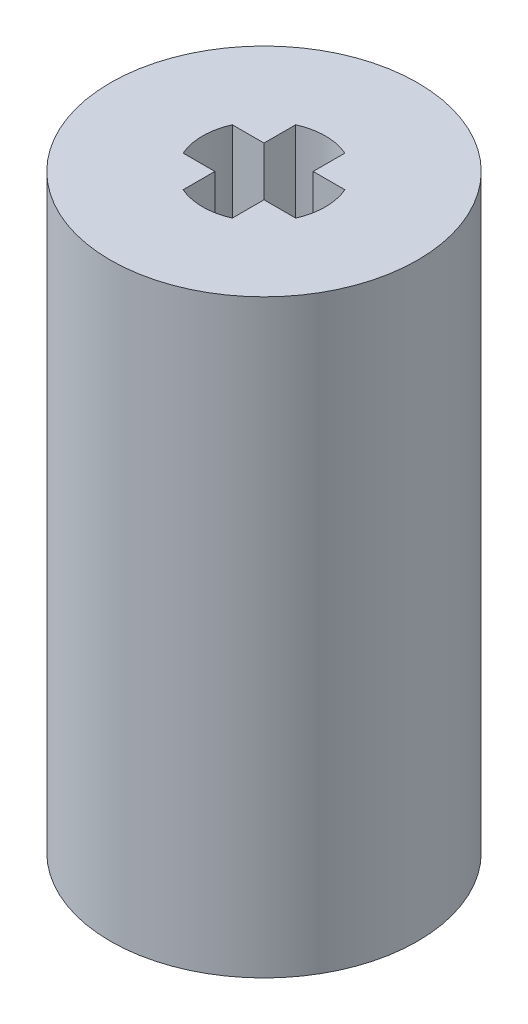
ISO-10303-21;
HEADER;
FILE_DESCRIPTION(('STEP AP214'),'2;1');
FILE_NAME('part.step','',(''),(''),'','','');
FILE_SCHEMA(('AUTOMOTIVE_DESIGN { 1 0 10303 214 1 1 1 1 }'));
ENDSEC;
DATA;
#1=APPLICATION_CONTEXT('core data for automotive mechanical design processes');
#2=APPLICATION_PROTOCOL_DEFINITION('international standard','automotive_design',2000,#1);
#3=PRODUCT_CONTEXT('',#1,'mechanical');
#4=PRODUCT('Part','Part','',(#3));
#5=PRODUCT_RELATED_PRODUCT_CATEGORY('part','',(#4));
#6=PRODUCT_DEFINITION_FORMATION('','',#4);
#7=PRODUCT_DEFINITION_CONTEXT('part definition',#1,'design');
#8=PRODUCT_DEFINITION('design','',#6,#7);
#9=PRODUCT_DEFINITION_SHAPE('','',#8);
#10=(LENGTH_UNIT() NAMED_UNIT(*) SI_UNIT(.MILLI.,.METRE.));
#11=(NAMED_UNIT(*) PLANE_ANGLE_UNIT() SI_UNIT($,.RADIAN.));
#12=(NAMED_UNIT(*) SI_UNIT($,.STERADIAN.) SOLID_ANGLE_UNIT());
#13=UNCERTAINTY_MEASURE_WITH_UNIT(LENGTH_MEASURE(1.E-05),#10,'distance_accuracy_value','');
#14=(GEOMETRIC_REPRESENTATION_CONTEXT(3) GLOBAL_UNCERTAINTY_ASSIGNED_CONTEXT((#13)) GLOBAL_UNIT_ASSIGNED_CONTEXT((#10,
#11,#12)) REPRESENTATION_CONTEXT('',''));
#15=CARTESIAN_POINT('',(0.,0.,0.));
#16=DIRECTION('',(0.,0.,1.));
#17=DIRECTION('',(1.,0.,0.));
#18=AXIS2_PLACEMENT_3D('',#15,#16,#17);
#19=CARTESIAN_POINT('',(0.,24.,0.));
#20=DIRECTION('',(0.,1.,0.));
#21=DIRECTION('',(0.,0.,1.));
#22=AXIS2_PLACEMENT_3D('',#19,#20,#21);
#23=PLANE('',#22);
#24=CARTESIAN_POINT('',(0.,24.,0.));
#25=DIRECTION('',(0.,1.,0.));
#26=DIRECTION('',(0.,0.,1.));
#27=AXIS2_PLACEMENT_3D('',#24,#25,#26);
#28=CIRCLE('',#27,6.25);
#29=CARTESIAN_POINT('',(0.,24.,6.25));
#30=VERTEX_POINT('',#29);
#31=EDGE_CURVE('E11',#30,#30,#28,.T.);
#32=ORIENTED_EDGE('',*,*,#31,.T.);
#33=EDGE_LOOP('',(#32));
#34=FACE_BOUND('',#33,.T.);
#35=DIRECTION('',(0.,0.,-1.));
#36=VECTOR('',#35,1.);
#37=CARTESIAN_POINT('',(-1.,24.,0.));
#38=LINE('',#37,#36);
#39=CARTESIAN_POINT('',(-1.,24.,-1.));
#40=VERTEX_POINT('',#39);
#41=CARTESIAN_POINT('',(-1.,24.,-2.29128784747792));
#42=VERTEX_POINT('',#41);
#43=EDGE_CURVE('E186',#40,#42,#38,.T.);
#44=ORIENTED_EDGE('',*,*,#43,.T.);
#45=CARTESIAN_POINT('',(0.,24.,0.));
#46=DIRECTION('',(0.,1.,0.));
#47=DIRECTION('',(0.,0.,1.));
#48=AXIS2_PLACEMENT_3D('',#45,#46,#47);
#49=CIRCLE('',#48,2.5);
#50=CARTESIAN_POINT('',(1.,24.,-2.29128784747792));
#51=VERTEX_POINT('',#50);
#52=EDGE_CURVE('E50',#42,#51,#49,.F.);
#53=ORIENTED_EDGE('',*,*,#52,.T.);
#54=DIRECTION('',(0.,0.,-1.));
#55=VECTOR('',#54,1.);
#56=CARTESIAN_POINT('',(1.,24.,0.));
#57=LINE('',#56,#55);
#58=CARTESIAN_POINT('',(1.,24.,-1.));
#59=VERTEX_POINT('',#58);
#60=EDGE_CURVE('E157',#59,#51,#57,.T.);
#61=ORIENTED_EDGE('',*,*,#60,.F.);
#62=DIRECTION('',(1.,0.,0.));
#63=VECTOR('',#62,1.);
#64=CARTESIAN_POINT('',(0.,24.,-1.));
#65=LINE('',#64,#63);
#66=CARTESIAN_POINT('',(2.29128784747792,24.,-1.));
#67=VERTEX_POINT('',#66);
#68=EDGE_CURVE('E160',#59,#67,#65,.T.);
#69=ORIENTED_EDGE('',*,*,#68,.T.);
#70=CARTESIAN_POINT('',(0.,24.,0.));
#71=DIRECTION('',(0.,1.,0.));
#72=DIRECTION('',(0.,0.,1.));
#73=AXIS2_PLACEMENT_3D('',#70,#71,#72);
#74=CIRCLE('',#73,2.5);
#75=CARTESIAN_POINT('',(2.29128784747792,24.,1.));
#76=VERTEX_POINT('',#75);
#77=EDGE_CURVE('E209',#67,#76,#74,.F.);
#78=ORIENTED_EDGE('',*,*,#77,.T.);
#79=DIRECTION('',(1.,0.,0.));
#80=VECTOR('',#79,1.);
#81=CARTESIAN_POINT('',(0.,24.,1.));
#82=LINE('',#81,#80);
#83=CARTESIAN_POINT('',(1.,24.,1.));
#84=VERTEX_POINT('',#83);
#85=EDGE_CURVE('E206',#84,#76,#82,.T.);
#86=ORIENTED_EDGE('',*,*,#85,.F.);
#87=DIRECTION('',(0.,0.,-1.));
#88=VECTOR('',#87,1.);
#89=CARTESIAN_POINT('',(1.,24.,0.));
#90=LINE('',#89,#88);
#91=CARTESIAN_POINT('',(1.,24.,2.29128784747792));
#92=VERTEX_POINT('',#91);
#93=EDGE_CURVE('E203',#92,#84,#90,.T.);
#94=ORIENTED_EDGE('',*,*,#93,.F.);
#95=CARTESIAN_POINT('',(0.,24.,0.));
#96=DIRECTION('',(0.,1.,0.));
#97=DIRECTION('',(0.,0.,1.));
#98=AXIS2_PLACEMENT_3D('',#95,#96,#97);
#99=CIRCLE('',#98,2.5);
#100=CARTESIAN_POINT('',(-1.,24.,2.29128784747792));
#101=VERTEX_POINT('',#100);
#102=EDGE_CURVE('E200',#92,#101,#99,.F.);
#103=ORIENTED_EDGE('',*,*,#102,.T.);
#104=DIRECTION('',(0.,0.,-1.));
#105=VECTOR('',#104,1.);
#106=CARTESIAN_POINT('',(-1.,24.,0.));
#107=LINE('',#106,#105);
#108=CARTESIAN_POINT('',(-1.,24.,1.));
#109=VERTEX_POINT('',#108);
#110=EDGE_CURVE('E197',#101,#109,#107,.T.);
#111=ORIENTED_EDGE('',*,*,#110,.T.);
#112=DIRECTION('',(1.,0.,0.));
#113=VECTOR('',#112,1.);
#114=CARTESIAN_POINT('',(0.,24.,1.));
#115=LINE('',#114,#113);
#116=CARTESIAN_POINT('',(-2.29128784747792,24.,1.));
#117=VERTEX_POINT('',#116);
#118=EDGE_CURVE('E194',#117,#109,#115,.T.);
#119=ORIENTED_EDGE('',*,*,#118,.F.);
#120=CARTESIAN_POINT('',(0.,24.,0.));
#121=DIRECTION('',(0.,1.,0.));
#122=DIRECTION('',(0.,0.,1.));
#123=AXIS2_PLACEMENT_3D('',#120,#121,#122);
#124=CIRCLE('',#123,2.5);
#125=CARTESIAN_POINT('',(-2.29128784747792,24.,-1.));
#126=VERTEX_POINT('',#125);
#127=EDGE_CURVE('E191',#126,#117,#124,.T.);
#128=ORIENTED_EDGE('',*,*,#127,.F.);
#129=DIRECTION('',(1.,0.,0.));
#130=VECTOR('',#129,1.);
#131=CARTESIAN_POINT('',(0.,24.,-1.));
#132=LINE('',#131,#130);
#133=EDGE_CURVE('E188',#126,#40,#132,.T.);
#134=ORIENTED_EDGE('',*,*,#133,.T.);
#135=EDGE_LOOP('',(#44,#53,#61,#69,#78,#86,#94,#103,#111,#119,#128,#134));
#136=FACE_BOUND('',#135,.T.);
#137=ADVANCED_FACE('F35',(#34,#136),#23,.T.);
#138=CARTESIAN_POINT('',(0.,24.,0.));
#139=DIRECTION('',(0.,-1.,0.));
#140=DIRECTION('',(0.,0.,-1.));
#141=AXIS2_PLACEMENT_3D('',#138,#139,#140);
#142=CYLINDRICAL_SURFACE('',#141,6.25);
#143=ORIENTED_EDGE('',*,*,#31,.F.);
#144=EDGE_LOOP('',(#143));
#145=FACE_BOUND('',#144,.T.);
#146=CARTESIAN_POINT('',(0.,0.,0.));
#147=DIRECTION('',(0.,1.,0.));
#148=DIRECTION('',(0.,0.,1.));
#149=AXIS2_PLACEMENT_3D('',#146,#147,#148);
#150=CIRCLE('',#149,6.25);
#151=CARTESIAN_POINT('',(0.,0.,6.25));
#152=VERTEX_POINT('',#151);
#153=EDGE_CURVE('E39',#152,#152,#150,.T.);
#154=ORIENTED_EDGE('',*,*,#153,.T.);
#155=EDGE_LOOP('',(#154));
#156=FACE_BOUND('',#155,.T.);
#157=ADVANCED_FACE('F37',(#145,#156),#142,.T.);
#158=CARTESIAN_POINT('',(0.,0.,0.));
#159=DIRECTION('',(0.,1.,0.));
#160=DIRECTION('',(0.,0.,1.));
#161=AXIS2_PLACEMENT_3D('',#158,#159,#160);
#162=PLANE('',#161);
#163=DIRECTION('',(0.,0.,1.));
#164=VECTOR('',#163,1.);
#165=CARTESIAN_POINT('',(1.67163841784041,0.,3.075));
#166=LINE('',#165,#164);
#167=CARTESIAN_POINT('',(1.67163841784041,0.,-3.075));
#168=VERTEX_POINT('',#167);
#169=CARTESIAN_POINT('',(1.67163841784041,0.,3.075));
#170=VERTEX_POINT('',#169);
#171=EDGE_CURVE('E239',#168,#170,#166,.T.);
#172=ORIENTED_EDGE('',*,*,#171,.F.);
#173=CARTESIAN_POINT('',(0.,0.,0.));
#174=DIRECTION('',(0.,-1.,0.));
#175=DIRECTION('',(0.,0.,1.));
#176=AXIS2_PLACEMENT_3D('',#173,#174,#175);
#177=CIRCLE('',#176,3.5);
#178=EDGE_CURVE('E58',#170,#168,#177,.T.);
#179=ORIENTED_EDGE('',*,*,#178,.F.);
#180=EDGE_LOOP('',(#172,#179));
#181=FACE_BOUND('',#180,.T.);
#182=ORIENTED_EDGE('',*,*,#153,.F.);
#183=EDGE_LOOP('',(#182));
#184=FACE_BOUND('',#183,.T.);
#185=ADVANCED_FACE('F254',(#181,#184),#162,.F.);
#186=CARTESIAN_POINT('',(0.,12.,0.));
#187=DIRECTION('',(0.,-1.,0.));
#188=DIRECTION('',(0.,0.,-1.));
#189=AXIS2_PLACEMENT_3D('',#186,#187,#188);
#190=CYLINDRICAL_SURFACE('',#189,3.5);
#191=ORIENTED_EDGE('',*,*,#178,.T.);
#192=DIRECTION('',(0.,-1.,0.));
#193=VECTOR('',#192,1.);
#194=CARTESIAN_POINT('',(1.67163841784041,12.,-3.075));
#195=LINE('',#194,#193);
#196=CARTESIAN_POINT('',(1.67163841784041,12.,-3.075));
#197=VERTEX_POINT('',#196);
#198=EDGE_CURVE('E242',#197,#168,#195,.T.);
#199=ORIENTED_EDGE('',*,*,#198,.F.);
#200=CARTESIAN_POINT('',(0.,12.,0.));
#201=DIRECTION('',(0.,-1.,0.));
#202=DIRECTION('',(0.,0.,1.));
#203=AXIS2_PLACEMENT_3D('',#200,#201,#202);
#204=CIRCLE('',#203,3.5);
#205=CARTESIAN_POINT('',(1.67163841784041,12.,3.075));
#206=VERTEX_POINT('',#205);
#207=EDGE_CURVE('E235',#206,#197,#204,.T.);
#208=ORIENTED_EDGE('',*,*,#207,.F.);
#209=DIRECTION('',(0.,-1.,0.));
#210=VECTOR('',#209,1.);
#211=CARTESIAN_POINT('',(1.67163841784041,12.,3.075));
#212=LINE('',#211,#210);
#213=EDGE_CURVE('E246',#206,#170,#212,.T.);
#214=ORIENTED_EDGE('',*,*,#213,.T.);
#215=EDGE_LOOP('',(#191,#199,#208,#214));
#216=FACE_BOUND('',#215,.T.);
#217=ADVANCED_FACE('F257',(#216),#190,.F.);
#218=CARTESIAN_POINT('',(1.67163841784041,12.,3.075));
#219=DIRECTION('',(1.,0.,0.));
#220=DIRECTION('',(0.,0.,-1.));
#221=AXIS2_PLACEMENT_3D('',#218,#219,#220);
#222=PLANE('',#221);
#223=ORIENTED_EDGE('',*,*,#171,.T.);
#224=ORIENTED_EDGE('',*,*,#213,.F.);
#225=DIRECTION('',(0.,0.,1.));
#226=VECTOR('',#225,1.);
#227=CARTESIAN_POINT('',(1.67163841784041,12.,3.075));
#228=LINE('',#227,#226);
#229=EDGE_CURVE('E238',#197,#206,#228,.T.);
#230=ORIENTED_EDGE('',*,*,#229,.F.);
#231=ORIENTED_EDGE('',*,*,#198,.T.);
#232=EDGE_LOOP('',(#223,#224,#230,#231));
#233=FACE_BOUND('',#232,.T.);
#234=ADVANCED_FACE('F251',(#233),#222,.F.);
#235=CARTESIAN_POINT('',(0.,12.,0.));
#236=DIRECTION('',(0.,1.,0.));
#237=DIRECTION('',(0.,0.,1.));
#238=AXIS2_PLACEMENT_3D('',#235,#236,#237);
#239=PLANE('',#238);
#240=ORIENTED_EDGE('',*,*,#207,.T.);
#241=ORIENTED_EDGE('',*,*,#229,.T.);
#242=EDGE_LOOP('',(#240,#241));
#243=FACE_BOUND('',#242,.T.);
#244=ADVANCED_FACE('F318',(#243),#239,.F.);
#245=CARTESIAN_POINT('',(0.,14.,0.));
#246=DIRECTION('',(0.,1.,0.));
#247=DIRECTION('',(0.,0.,1.));
#248=AXIS2_PLACEMENT_3D('',#245,#246,#247);
#249=CYLINDRICAL_SURFACE('',#248,2.5);
#250=ORIENTED_EDGE('',*,*,#52,.F.);
#251=DIRECTION('',(0.,1.,0.));
#252=VECTOR('',#251,1.);
#253=CARTESIAN_POINT('',(-1.,14.,-2.29128784747792));
#254=LINE('',#253,#252);
#255=CARTESIAN_POINT('',(-1.,14.,-2.29128784747792));
#256=VERTEX_POINT('',#255);
#257=EDGE_CURVE('E140',#256,#42,#254,.T.);
#258=ORIENTED_EDGE('',*,*,#257,.F.);
#259=CARTESIAN_POINT('',(0.,14.,0.));
#260=DIRECTION('',(0.,1.,0.));
#261=DIRECTION('',(0.,0.,1.));
#262=AXIS2_PLACEMENT_3D('',#259,#260,#261);
#263=CIRCLE('',#262,2.5);
#264=CARTESIAN_POINT('',(1.,14.,-2.29128784747792));
#265=VERTEX_POINT('',#264);
#266=EDGE_CURVE('E147',#256,#265,#263,.F.);
#267=ORIENTED_EDGE('',*,*,#266,.T.);
#268=DIRECTION('',(0.,1.,0.));
#269=VECTOR('',#268,1.);
#270=CARTESIAN_POINT('',(1.,14.,-2.29128784747792));
#271=LINE('',#270,#269);
#272=EDGE_CURVE('E214',#265,#51,#271,.T.);
#273=ORIENTED_EDGE('',*,*,#272,.T.);
#274=EDGE_LOOP('',(#250,#258,#267,#273));
#275=FACE_BOUND('',#274,.T.);
#276=ADVANCED_FACE('F149',(#275),#249,.F.);
#277=CARTESIAN_POINT('',(1.,14.,0.));
#278=DIRECTION('',(1.,0.,0.));
#279=DIRECTION('',(0.,0.,-1.));
#280=AXIS2_PLACEMENT_3D('',#277,#278,#279);
#281=PLANE('',#280);
#282=ORIENTED_EDGE('',*,*,#60,.T.);
#283=ORIENTED_EDGE('',*,*,#272,.F.);
#284=DIRECTION('',(0.,0.,-1.));
#285=VECTOR('',#284,1.);
#286=CARTESIAN_POINT('',(1.,14.,0.));
#287=LINE('',#286,#285);
#288=CARTESIAN_POINT('',(1.,14.,-1.));
#289=VERTEX_POINT('',#288);
#290=EDGE_CURVE('E151',#289,#265,#287,.T.);
#291=ORIENTED_EDGE('',*,*,#290,.F.);
#292=DIRECTION('',(0.,1.,0.));
#293=VECTOR('',#292,1.);
#294=CARTESIAN_POINT('',(1.,14.,-1.));
#295=LINE('',#294,#293);
#296=EDGE_CURVE('E216',#289,#59,#295,.T.);
#297=ORIENTED_EDGE('',*,*,#296,.T.);
#298=EDGE_LOOP('',(#282,#283,#291,#297));
#299=FACE_BOUND('',#298,.T.);
#300=ADVANCED_FACE('F310',(#299),#281,.F.);
#301=CARTESIAN_POINT('',(0.,14.,-1.));
#302=DIRECTION('',(0.,0.,1.));
#303=DIRECTION('',(1.,0.,0.));
#304=AXIS2_PLACEMENT_3D('',#301,#302,#303);
#305=PLANE('',#304);
#306=ORIENTED_EDGE('',*,*,#68,.F.);
#307=ORIENTED_EDGE('',*,*,#296,.F.);
#308=DIRECTION('',(1.,0.,0.));
#309=VECTOR('',#308,1.);
#310=CARTESIAN_POINT('',(0.,14.,-1.));
#311=LINE('',#310,#309);
#312=CARTESIAN_POINT('',(2.29128784747792,14.,-1.));
#313=VERTEX_POINT('',#312);
#314=EDGE_CURVE('E182',#289,#313,#311,.T.);
#315=ORIENTED_EDGE('',*,*,#314,.T.);
#316=DIRECTION('',(0.,1.,0.));
#317=VECTOR('',#316,1.);
#318=CARTESIAN_POINT('',(2.29128784747792,14.,-1.));
#319=LINE('',#318,#317);
#320=EDGE_CURVE('E218',#313,#67,#319,.T.);
#321=ORIENTED_EDGE('',*,*,#320,.T.);
#322=EDGE_LOOP('',(#306,#307,#315,#321));
#323=FACE_BOUND('',#322,.T.);
#324=ADVANCED_FACE('F308',(#323),#305,.T.);
#325=CARTESIAN_POINT('',(0.,14.,0.));
#326=DIRECTION('',(0.,1.,0.));
#327=DIRECTION('',(0.,0.,1.));
#328=AXIS2_PLACEMENT_3D('',#325,#326,#327);
#329=CYLINDRICAL_SURFACE('',#328,2.5);
#330=ORIENTED_EDGE('',*,*,#77,.F.);
#331=ORIENTED_EDGE('',*,*,#320,.F.);
#332=CARTESIAN_POINT('',(0.,14.,0.));
#333=DIRECTION('',(0.,1.,0.));
#334=DIRECTION('',(0.,0.,1.));
#335=AXIS2_PLACEMENT_3D('',#332,#333,#334);
#336=CIRCLE('',#335,2.5);
#337=CARTESIAN_POINT('',(2.29128784747792,14.,1.));
#338=VERTEX_POINT('',#337);
#339=EDGE_CURVE('E180',#313,#338,#336,.F.);
#340=ORIENTED_EDGE('',*,*,#339,.T.);
#341=DIRECTION('',(0.,1.,0.));
#342=VECTOR('',#341,1.);
#343=CARTESIAN_POINT('',(2.29128784747792,14.,1.));
#344=LINE('',#343,#342);
#345=EDGE_CURVE('E220',#338,#76,#344,.T.);
#346=ORIENTED_EDGE('',*,*,#345,.T.);
#347=EDGE_LOOP('',(#330,#331,#340,#346));
#348=FACE_BOUND('',#347,.T.);
#349=ADVANCED_FACE('F304',(#348),#329,.F.);
#350=CARTESIAN_POINT('',(0.,14.,1.));
#351=DIRECTION('',(0.,0.,1.));
#352=DIRECTION('',(1.,0.,0.));
#353=AXIS2_PLACEMENT_3D('',#350,#351,#352);
#354=PLANE('',#353);
#355=ORIENTED_EDGE('',*,*,#85,.T.);
#356=ORIENTED_EDGE('',*,*,#345,.F.);
#357=DIRECTION('',(1.,0.,0.));
#358=VECTOR('',#357,1.);
#359=CARTESIAN_POINT('',(0.,14.,1.));
#360=LINE('',#359,#358);
#361=CARTESIAN_POINT('',(1.,14.,1.));
#362=VERTEX_POINT('',#361);
#363=EDGE_CURVE('E177',#362,#338,#360,.T.);
#364=ORIENTED_EDGE('',*,*,#363,.F.);
#365=DIRECTION('',(0.,1.,0.));
#366=VECTOR('',#365,1.);
#367=CARTESIAN_POINT('',(1.,14.,1.));
#368=LINE('',#367,#366);
#369=EDGE_CURVE('E222',#362,#84,#368,.T.);
#370=ORIENTED_EDGE('',*,*,#369,.T.);
#371=EDGE_LOOP('',(#355,#356,#364,#370));
#372=FACE_BOUND('',#371,.T.);
#373=ADVANCED_FACE('F301',(#372),#354,.F.);
#374=CARTESIAN_POINT('',(1.,14.,0.));
#375=DIRECTION('',(1.,0.,0.));
#376=DIRECTION('',(0.,0.,-1.));
#377=AXIS2_PLACEMENT_3D('',#374,#375,#376);
#378=PLANE('',#377);
#379=ORIENTED_EDGE('',*,*,#93,.T.);
#380=ORIENTED_EDGE('',*,*,#369,.F.);
#381=DIRECTION('',(0.,0.,-1.));
#382=VECTOR('',#381,1.);
#383=CARTESIAN_POINT('',(1.,14.,0.));
#384=LINE('',#383,#382);
#385=CARTESIAN_POINT('',(1.,14.,2.29128784747792));
#386=VERTEX_POINT('',#385);
#387=EDGE_CURVE('E174',#386,#362,#384,.T.);
#388=ORIENTED_EDGE('',*,*,#387,.F.);
#389=DIRECTION('',(0.,1.,0.));
#390=VECTOR('',#389,1.);
#391=CARTESIAN_POINT('',(1.,14.,2.29128784747792));
#392=LINE('',#391,#390);
#393=EDGE_CURVE('E224',#386,#92,#392,.T.);
#394=ORIENTED_EDGE('',*,*,#393,.T.);
#395=EDGE_LOOP('',(#379,#380,#388,#394));
#396=FACE_BOUND('',#395,.T.);
#397=ADVANCED_FACE('F295',(#396),#378,.F.);
#398=CARTESIAN_POINT('',(0.,14.,0.));
#399=DIRECTION('',(0.,1.,0.));
#400=DIRECTION('',(0.,0.,1.));
#401=AXIS2_PLACEMENT_3D('',#398,#399,#400);
#402=CYLINDRICAL_SURFACE('',#401,2.5);
#403=ORIENTED_EDGE('',*,*,#102,.F.);
#404=ORIENTED_EDGE('',*,*,#393,.F.);
#405=CARTESIAN_POINT('',(0.,14.,0.));
#406=DIRECTION('',(0.,1.,0.));
#407=DIRECTION('',(0.,0.,1.));
#408=AXIS2_PLACEMENT_3D('',#405,#406,#407);
#409=CIRCLE('',#408,2.5);
#410=CARTESIAN_POINT('',(-1.,14.,2.29128784747792));
#411=VERTEX_POINT('',#410);
#412=EDGE_CURVE('E172',#386,#411,#409,.F.);
#413=ORIENTED_EDGE('',*,*,#412,.T.);
#414=DIRECTION('',(0.,1.,0.));
#415=VECTOR('',#414,1.);
#416=CARTESIAN_POINT('',(-1.,14.,2.29128784747792));
#417=LINE('',#416,#415);
#418=EDGE_CURVE('E226',#411,#101,#417,.T.);
#419=ORIENTED_EDGE('',*,*,#418,.T.);
#420=EDGE_LOOP('',(#403,#404,#413,#419));
#421=FACE_BOUND('',#420,.T.);
#422=ADVANCED_FACE('F292',(#421),#402,.F.);
#423=CARTESIAN_POINT('',(-1.,14.,0.));
#424=DIRECTION('',(1.,0.,0.));
#425=DIRECTION('',(0.,0.,-1.));
#426=AXIS2_PLACEMENT_3D('',#423,#424,#425);
#427=PLANE('',#426);
#428=ORIENTED_EDGE('',*,*,#110,.F.);
#429=ORIENTED_EDGE('',*,*,#418,.F.);
#430=DIRECTION('',(0.,0.,-1.));
#431=VECTOR('',#430,1.);
#432=CARTESIAN_POINT('',(-1.,14.,0.));
#433=LINE('',#432,#431);
#434=CARTESIAN_POINT('',(-1.,14.,1.));
#435=VERTEX_POINT('',#434);
#436=EDGE_CURVE('E170',#411,#435,#433,.T.);
#437=ORIENTED_EDGE('',*,*,#436,.T.);
#438=DIRECTION('',(0.,1.,0.));
#439=VECTOR('',#438,1.);
#440=CARTESIAN_POINT('',(-1.,14.,1.));
#441=LINE('',#440,#439);
#442=EDGE_CURVE('E228',#435,#109,#441,.T.);
#443=ORIENTED_EDGE('',*,*,#442,.T.);
#444=EDGE_LOOP('',(#428,#429,#437,#443));
#445=FACE_BOUND('',#444,.T.);
#446=ADVANCED_FACE('F289',(#445),#427,.T.);
#447=CARTESIAN_POINT('',(0.,14.,1.));
#448=DIRECTION('',(0.,0.,1.));
#449=DIRECTION('',(1.,0.,0.));
#450=AXIS2_PLACEMENT_3D('',#447,#448,#449);
#451=PLANE('',#450);
#452=ORIENTED_EDGE('',*,*,#118,.T.);
#453=ORIENTED_EDGE('',*,*,#442,.F.);
#454=DIRECTION('',(1.,0.,0.));
#455=VECTOR('',#454,1.);
#456=CARTESIAN_POINT('',(0.,14.,1.));
#457=LINE('',#456,#455);
#458=CARTESIAN_POINT('',(-2.29128784747792,14.,1.));
#459=VERTEX_POINT('',#458);
#460=EDGE_CURVE('E167',#459,#435,#457,.T.);
#461=ORIENTED_EDGE('',*,*,#460,.F.);
#462=DIRECTION('',(0.,1.,0.));
#463=VECTOR('',#462,1.);
#464=CARTESIAN_POINT('',(-2.29128784747792,14.,1.));
#465=LINE('',#464,#463);
#466=EDGE_CURVE('E230',#459,#117,#465,.T.);
#467=ORIENTED_EDGE('',*,*,#466,.T.);
#468=EDGE_LOOP('',(#452,#453,#461,#467));
#469=FACE_BOUND('',#468,.T.);
#470=ADVANCED_FACE('F282',(#469),#451,.F.);
#471=CARTESIAN_POINT('',(0.,14.,0.));
#472=DIRECTION('',(0.,1.,0.));
#473=DIRECTION('',(0.,0.,1.));
#474=AXIS2_PLACEMENT_3D('',#471,#472,#473);
#475=CYLINDRICAL_SURFACE('',#474,2.5);
#476=ORIENTED_EDGE('',*,*,#127,.T.);
#477=ORIENTED_EDGE('',*,*,#466,.F.);
#478=CARTESIAN_POINT('',(0.,14.,0.));
#479=DIRECTION('',(0.,1.,0.));
#480=DIRECTION('',(0.,0.,1.));
#481=AXIS2_PLACEMENT_3D('',#478,#479,#480);
#482=CIRCLE('',#481,2.5);
#483=CARTESIAN_POINT('',(-2.29128784747792,14.,-1.));
#484=VERTEX_POINT('',#483);
#485=EDGE_CURVE('E164',#484,#459,#482,.T.);
#486=ORIENTED_EDGE('',*,*,#485,.F.);
#487=DIRECTION('',(0.,1.,0.));
#488=VECTOR('',#487,1.);
#489=CARTESIAN_POINT('',(-2.29128784747792,14.,-1.));
#490=LINE('',#489,#488);
#491=EDGE_CURVE('E232',#484,#126,#490,.T.);
#492=ORIENTED_EDGE('',*,*,#491,.T.);
#493=EDGE_LOOP('',(#476,#477,#486,#492));
#494=FACE_BOUND('',#493,.T.);
#495=ADVANCED_FACE('F278',(#494),#475,.F.);
#496=CARTESIAN_POINT('',(0.,14.,-1.));
#497=DIRECTION('',(0.,0.,1.));
#498=DIRECTION('',(1.,0.,0.));
#499=AXIS2_PLACEMENT_3D('',#496,#497,#498);
#500=PLANE('',#499);
#501=ORIENTED_EDGE('',*,*,#133,.F.);
#502=ORIENTED_EDGE('',*,*,#491,.F.);
#503=DIRECTION('',(1.,0.,0.));
#504=VECTOR('',#503,1.);
#505=CARTESIAN_POINT('',(0.,14.,-1.));
#506=LINE('',#505,#504);
#507=CARTESIAN_POINT('',(-1.,14.,-1.));
#508=VERTEX_POINT('',#507);
#509=EDGE_CURVE('E146',#484,#508,#506,.T.);
#510=ORIENTED_EDGE('',*,*,#509,.T.);
#511=DIRECTION('',(0.,1.,0.));
#512=VECTOR('',#511,1.);
#513=CARTESIAN_POINT('',(-1.,14.,-1.));
#514=LINE('',#513,#512);
#515=EDGE_CURVE('E142',#508,#40,#514,.T.);
#516=ORIENTED_EDGE('',*,*,#515,.T.);
#517=EDGE_LOOP('',(#501,#502,#510,#516));
#518=FACE_BOUND('',#517,.T.);
#519=ADVANCED_FACE('F275',(#518),#500,.T.);
#520=CARTESIAN_POINT('',(-1.,14.,0.));
#521=DIRECTION('',(1.,0.,0.));
#522=DIRECTION('',(0.,0.,-1.));
#523=AXIS2_PLACEMENT_3D('',#520,#521,#522);
#524=PLANE('',#523);
#525=ORIENTED_EDGE('',*,*,#43,.F.);
#526=ORIENTED_EDGE('',*,*,#515,.F.);
#527=DIRECTION('',(0.,0.,-1.));
#528=VECTOR('',#527,1.);
#529=CARTESIAN_POINT('',(-1.,14.,0.));
#530=LINE('',#529,#528);
#531=EDGE_CURVE('E137',#508,#256,#530,.T.);
#532=ORIENTED_EDGE('',*,*,#531,.T.);
#533=ORIENTED_EDGE('',*,*,#257,.T.);
#534=EDGE_LOOP('',(#525,#526,#532,#533));
#535=FACE_BOUND('',#534,.T.);
#536=ADVANCED_FACE('F139',(#535),#524,.T.);
#537=CARTESIAN_POINT('',(0.,14.,0.));
#538=DIRECTION('',(0.,1.,0.));
#539=DIRECTION('',(0.,0.,1.));
#540=AXIS2_PLACEMENT_3D('',#537,#538,#539);
#541=PLANE('',#540);
#542=ORIENTED_EDGE('',*,*,#266,.F.);
#543=ORIENTED_EDGE('',*,*,#531,.F.);
#544=ORIENTED_EDGE('',*,*,#509,.F.);
#545=ORIENTED_EDGE('',*,*,#485,.T.);
#546=ORIENTED_EDGE('',*,*,#460,.T.);
#547=ORIENTED_EDGE('',*,*,#436,.F.);
#548=ORIENTED_EDGE('',*,*,#412,.F.);
#549=ORIENTED_EDGE('',*,*,#387,.T.);
#550=ORIENTED_EDGE('',*,*,#363,.T.);
#551=ORIENTED_EDGE('',*,*,#339,.F.);
#552=ORIENTED_EDGE('',*,*,#314,.F.);
#553=ORIENTED_EDGE('',*,*,#290,.T.);
#554=EDGE_LOOP('',(#542,#543,#544,#545,#546,#547,#548,#549,#550,#551,#552,#553));
#555=FACE_BOUND('',#554,.T.);
#556=ADVANCED_FACE('F154',(#555),#541,.T.);
#557=CLOSED_SHELL('',(#137,#157,#185,#217,#234,#244,#276,#300,#324,#349,#373,#397,#422,#446,
#470,#495,#519,#536,#556));
#558=MANIFOLD_SOLID_BREP('B2',#557);
#559=ADVANCED_BREP_SHAPE_REPRESENTATION('',(#18,#558),#14);
#560=SHAPE_DEFINITION_REPRESENTATION(#9,#559);
ENDSEC;
END-ISO-10303-21;
